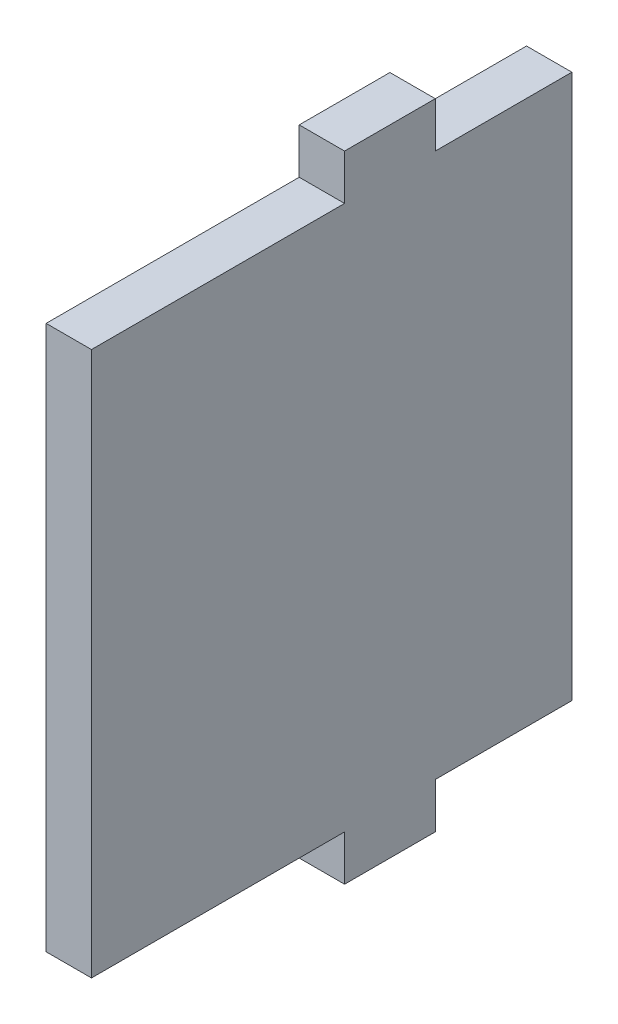
ISO-10303-21;
HEADER;
FILE_DESCRIPTION(('STEP AP214'),'2;1');
FILE_NAME('part.step','',(''),(''),'','','');
FILE_SCHEMA(('AUTOMOTIVE_DESIGN { 1 0 10303 214 1 1 1 1 }'));
ENDSEC;
DATA;
#1=APPLICATION_CONTEXT('core data for automotive mechanical design processes');
#2=APPLICATION_PROTOCOL_DEFINITION('international standard','automotive_design',2000,#1);
#3=PRODUCT_CONTEXT('',#1,'mechanical');
#4=PRODUCT('Part','Part','',(#3));
#5=PRODUCT_RELATED_PRODUCT_CATEGORY('part','',(#4));
#6=PRODUCT_DEFINITION_FORMATION('','',#4);
#7=PRODUCT_DEFINITION_CONTEXT('part definition',#1,'design');
#8=PRODUCT_DEFINITION('design','',#6,#7);
#9=PRODUCT_DEFINITION_SHAPE('','',#8);
#10=(LENGTH_UNIT() NAMED_UNIT(*) SI_UNIT(.MILLI.,.METRE.));
#11=(NAMED_UNIT(*) PLANE_ANGLE_UNIT() SI_UNIT($,.RADIAN.));
#12=(NAMED_UNIT(*) SI_UNIT($,.STERADIAN.) SOLID_ANGLE_UNIT());
#13=UNCERTAINTY_MEASURE_WITH_UNIT(LENGTH_MEASURE(1.E-05),#10,'distance_accuracy_value','');
#14=(GEOMETRIC_REPRESENTATION_CONTEXT(3) GLOBAL_UNCERTAINTY_ASSIGNED_CONTEXT((#13)) GLOBAL_UNIT_ASSIGNED_CONTEXT((#10,
#11,#12)) REPRESENTATION_CONTEXT('',''));
#15=CARTESIAN_POINT('',(0.,0.,0.));
#16=DIRECTION('',(0.,0.,1.));
#17=DIRECTION('',(1.,0.,0.));
#18=AXIS2_PLACEMENT_3D('',#15,#16,#17);
#19=CARTESIAN_POINT('',(2.5,-15.,0.));
#20=DIRECTION('',(0.,1.,0.));
#21=DIRECTION('',(0.,0.,1.));
#22=AXIS2_PLACEMENT_3D('',#19,#20,#21);
#23=PLANE('',#22);
#24=DIRECTION('',(0.,0.,-1.));
#25=VECTOR('',#24,1.);
#26=CARTESIAN_POINT('',(0.,-15.,0.));
#27=LINE('',#26,#25);
#28=CARTESIAN_POINT('',(0.,-15.,16.45));
#29=VERTEX_POINT('',#28);
#30=CARTESIAN_POINT('',(0.,-15.,2.5));
#31=VERTEX_POINT('',#30);
#32=EDGE_CURVE('E158',#29,#31,#27,.T.);
#33=ORIENTED_EDGE('',*,*,#32,.T.);
#34=DIRECTION('',(-1.,0.,0.));
#35=VECTOR('',#34,1.);
#36=CARTESIAN_POINT('',(2.5,-15.,2.5));
#37=LINE('',#36,#35);
#38=CARTESIAN_POINT('',(2.5,-15.,2.5));
#39=VERTEX_POINT('',#38);
#40=EDGE_CURVE('E11',#39,#31,#37,.T.);
#41=ORIENTED_EDGE('',*,*,#40,.F.);
#42=DIRECTION('',(0.,0.,-1.));
#43=VECTOR('',#42,1.);
#44=CARTESIAN_POINT('',(2.5,-15.,0.));
#45=LINE('',#44,#43);
#46=CARTESIAN_POINT('',(2.5,-15.,16.45));
#47=VERTEX_POINT('',#46);
#48=EDGE_CURVE('E186',#47,#39,#45,.T.);
#49=ORIENTED_EDGE('',*,*,#48,.F.);
#50=DIRECTION('',(-1.,0.,0.));
#51=VECTOR('',#50,1.);
#52=CARTESIAN_POINT('',(2.5,-15.,16.45));
#53=LINE('',#52,#51);
#54=EDGE_CURVE('E154',#47,#29,#53,.T.);
#55=ORIENTED_EDGE('',*,*,#54,.T.);
#56=EDGE_LOOP('',(#33,#41,#49,#55));
#57=FACE_BOUND('',#56,.T.);
#58=ADVANCED_FACE('F39',(#57),#23,.F.);
#59=CARTESIAN_POINT('',(2.5,0.,2.5));
#60=DIRECTION('',(0.,0.,-1.));
#61=DIRECTION('',(-1.,0.,0.));
#62=AXIS2_PLACEMENT_3D('',#59,#60,#61);
#63=PLANE('',#62);
#64=DIRECTION('',(0.,-1.,0.));
#65=VECTOR('',#64,1.);
#66=CARTESIAN_POINT('',(0.,0.,2.5));
#67=LINE('',#66,#65);
#68=CARTESIAN_POINT('',(0.,-17.5,2.5));
#69=VERTEX_POINT('',#68);
#70=EDGE_CURVE('E161',#31,#69,#67,.T.);
#71=ORIENTED_EDGE('',*,*,#70,.T.);
#72=DIRECTION('',(-1.,0.,0.));
#73=VECTOR('',#72,1.);
#74=CARTESIAN_POINT('',(2.5,-17.5,2.5));
#75=LINE('',#74,#73);
#76=CARTESIAN_POINT('',(2.5,-17.5,2.5));
#77=VERTEX_POINT('',#76);
#78=EDGE_CURVE('E47',#77,#69,#75,.T.);
#79=ORIENTED_EDGE('',*,*,#78,.F.);
#80=DIRECTION('',(0.,-1.,0.));
#81=VECTOR('',#80,1.);
#82=CARTESIAN_POINT('',(2.5,0.,2.5));
#83=LINE('',#82,#81);
#84=EDGE_CURVE('E106',#39,#77,#83,.T.);
#85=ORIENTED_EDGE('',*,*,#84,.F.);
#86=ORIENTED_EDGE('',*,*,#40,.T.);
#87=EDGE_LOOP('',(#71,#79,#85,#86));
#88=FACE_BOUND('',#87,.T.);
#89=ADVANCED_FACE('F256',(#88),#63,.F.);
#90=CARTESIAN_POINT('',(2.5,-17.5,0.));
#91=DIRECTION('',(0.,1.,0.));
#92=DIRECTION('',(0.,0.,1.));
#93=AXIS2_PLACEMENT_3D('',#90,#91,#92);
#94=PLANE('',#93);
#95=DIRECTION('',(0.,0.,-1.));
#96=VECTOR('',#95,1.);
#97=CARTESIAN_POINT('',(0.,-17.5,0.));
#98=LINE('',#97,#96);
#99=CARTESIAN_POINT('',(0.,-17.5,-2.5));
#100=VERTEX_POINT('',#99);
#101=EDGE_CURVE('E163',#69,#100,#98,.T.);
#102=ORIENTED_EDGE('',*,*,#101,.T.);
#103=DIRECTION('',(-1.,0.,0.));
#104=VECTOR('',#103,1.);
#105=CARTESIAN_POINT('',(2.5,-17.5,-2.5));
#106=LINE('',#105,#104);
#107=CARTESIAN_POINT('',(2.5,-17.5,-2.5));
#108=VERTEX_POINT('',#107);
#109=EDGE_CURVE('E201',#108,#100,#106,.T.);
#110=ORIENTED_EDGE('',*,*,#109,.F.);
#111=DIRECTION('',(0.,0.,-1.));
#112=VECTOR('',#111,1.);
#113=CARTESIAN_POINT('',(2.5,-17.5,0.));
#114=LINE('',#113,#112);
#115=EDGE_CURVE('E209',#77,#108,#114,.T.);
#116=ORIENTED_EDGE('',*,*,#115,.F.);
#117=ORIENTED_EDGE('',*,*,#78,.T.);
#118=EDGE_LOOP('',(#102,#110,#116,#117));
#119=FACE_BOUND('',#118,.T.);
#120=ADVANCED_FACE('F207',(#119),#94,.F.);
#121=CARTESIAN_POINT('',(2.5,0.,-2.5));
#122=DIRECTION('',(0.,0.,1.));
#123=DIRECTION('',(0.,-1.,0.));
#124=AXIS2_PLACEMENT_3D('',#121,#122,#123);
#125=PLANE('',#124);
#126=DIRECTION('',(0.,1.,0.));
#127=VECTOR('',#126,1.);
#128=CARTESIAN_POINT('',(0.,0.,-2.5));
#129=LINE('',#128,#127);
#130=CARTESIAN_POINT('',(0.,-15.,-2.5));
#131=VERTEX_POINT('',#130);
#132=EDGE_CURVE('E165',#100,#131,#129,.T.);
#133=ORIENTED_EDGE('',*,*,#132,.T.);
#134=DIRECTION('',(-1.,0.,0.));
#135=VECTOR('',#134,1.);
#136=CARTESIAN_POINT('',(2.5,-15.,-2.5));
#137=LINE('',#136,#135);
#138=CARTESIAN_POINT('',(2.5,-15.,-2.5));
#139=VERTEX_POINT('',#138);
#140=EDGE_CURVE('E198',#139,#131,#137,.T.);
#141=ORIENTED_EDGE('',*,*,#140,.F.);
#142=DIRECTION('',(0.,1.,0.));
#143=VECTOR('',#142,1.);
#144=CARTESIAN_POINT('',(2.5,0.,-2.5));
#145=LINE('',#144,#143);
#146=EDGE_CURVE('E227',#108,#139,#145,.T.);
#147=ORIENTED_EDGE('',*,*,#146,.F.);
#148=ORIENTED_EDGE('',*,*,#109,.T.);
#149=EDGE_LOOP('',(#133,#141,#147,#148));
#150=FACE_BOUND('',#149,.T.);
#151=ADVANCED_FACE('F217',(#150),#125,.F.);
#152=CARTESIAN_POINT('',(2.5,-15.,0.));
#153=DIRECTION('',(0.,1.,0.));
#154=DIRECTION('',(0.,0.,1.));
#155=AXIS2_PLACEMENT_3D('',#152,#153,#154);
#156=PLANE('',#155);
#157=DIRECTION('',(0.,0.,-1.));
#158=VECTOR('',#157,1.);
#159=CARTESIAN_POINT('',(0.,-15.,0.));
#160=LINE('',#159,#158);
#161=CARTESIAN_POINT('',(0.,-15.,-10.03));
#162=VERTEX_POINT('',#161);
#163=EDGE_CURVE('E167',#131,#162,#160,.T.);
#164=ORIENTED_EDGE('',*,*,#163,.T.);
#165=DIRECTION('',(-1.,0.,0.));
#166=VECTOR('',#165,1.);
#167=CARTESIAN_POINT('',(2.5,-15.,-10.03));
#168=LINE('',#167,#166);
#169=CARTESIAN_POINT('',(2.5,-15.,-10.03));
#170=VERTEX_POINT('',#169);
#171=EDGE_CURVE('E196',#170,#162,#168,.T.);
#172=ORIENTED_EDGE('',*,*,#171,.F.);
#173=DIRECTION('',(0.,0.,-1.));
#174=VECTOR('',#173,1.);
#175=CARTESIAN_POINT('',(2.5,-15.,0.));
#176=LINE('',#175,#174);
#177=EDGE_CURVE('E223',#139,#170,#176,.T.);
#178=ORIENTED_EDGE('',*,*,#177,.F.);
#179=ORIENTED_EDGE('',*,*,#140,.T.);
#180=EDGE_LOOP('',(#164,#172,#178,#179));
#181=FACE_BOUND('',#180,.T.);
#182=ADVANCED_FACE('F221',(#181),#156,.F.);
#183=CARTESIAN_POINT('',(2.5,0.,-10.03));
#184=DIRECTION('',(0.,0.,-1.));
#185=DIRECTION('',(-1.,0.,0.));
#186=AXIS2_PLACEMENT_3D('',#183,#184,#185);
#187=PLANE('',#186);
#188=DIRECTION('',(0.,-1.,0.));
#189=VECTOR('',#188,1.);
#190=CARTESIAN_POINT('',(0.,0.,-10.03));
#191=LINE('',#190,#189);
#192=CARTESIAN_POINT('',(0.,15.,-10.03));
#193=VERTEX_POINT('',#192);
#194=EDGE_CURVE('E170',#193,#162,#191,.T.);
#195=ORIENTED_EDGE('',*,*,#194,.F.);
#196=DIRECTION('',(-1.,0.,0.));
#197=VECTOR('',#196,1.);
#198=CARTESIAN_POINT('',(2.5,15.,-10.03));
#199=LINE('',#198,#197);
#200=CARTESIAN_POINT('',(2.5,15.,-10.03));
#201=VERTEX_POINT('',#200);
#202=EDGE_CURVE('E194',#201,#193,#199,.T.);
#203=ORIENTED_EDGE('',*,*,#202,.F.);
#204=DIRECTION('',(0.,-1.,0.));
#205=VECTOR('',#204,1.);
#206=CARTESIAN_POINT('',(2.5,0.,-10.03));
#207=LINE('',#206,#205);
#208=EDGE_CURVE('E226',#201,#170,#207,.T.);
#209=ORIENTED_EDGE('',*,*,#208,.T.);
#210=ORIENTED_EDGE('',*,*,#171,.T.);
#211=EDGE_LOOP('',(#195,#203,#209,#210));
#212=FACE_BOUND('',#211,.T.);
#213=ADVANCED_FACE('F269',(#212),#187,.T.);
#214=CARTESIAN_POINT('',(2.5,15.,0.));
#215=DIRECTION('',(0.,1.,0.));
#216=DIRECTION('',(0.,0.,1.));
#217=AXIS2_PLACEMENT_3D('',#214,#215,#216);
#218=PLANE('',#217);
#219=DIRECTION('',(0.,0.,-1.));
#220=VECTOR('',#219,1.);
#221=CARTESIAN_POINT('',(0.,15.,0.));
#222=LINE('',#221,#220);
#223=CARTESIAN_POINT('',(0.,15.,-2.5));
#224=VERTEX_POINT('',#223);
#225=EDGE_CURVE('E173',#224,#193,#222,.T.);
#226=ORIENTED_EDGE('',*,*,#225,.F.);
#227=DIRECTION('',(-1.,0.,0.));
#228=VECTOR('',#227,1.);
#229=CARTESIAN_POINT('',(2.5,15.,-2.5));
#230=LINE('',#229,#228);
#231=CARTESIAN_POINT('',(2.5,15.,-2.5));
#232=VERTEX_POINT('',#231);
#233=EDGE_CURVE('E192',#232,#224,#230,.T.);
#234=ORIENTED_EDGE('',*,*,#233,.F.);
#235=DIRECTION('',(0.,0.,-1.));
#236=VECTOR('',#235,1.);
#237=CARTESIAN_POINT('',(2.5,15.,0.));
#238=LINE('',#237,#236);
#239=EDGE_CURVE('E229',#232,#201,#238,.T.);
#240=ORIENTED_EDGE('',*,*,#239,.T.);
#241=ORIENTED_EDGE('',*,*,#202,.T.);
#242=EDGE_LOOP('',(#226,#234,#240,#241));
#243=FACE_BOUND('',#242,.T.);
#244=ADVANCED_FACE('F272',(#243),#218,.T.);
#245=CARTESIAN_POINT('',(2.5,0.,-2.5));
#246=DIRECTION('',(0.,0.,-1.));
#247=DIRECTION('',(0.,1.,0.));
#248=AXIS2_PLACEMENT_3D('',#245,#246,#247);
#249=PLANE('',#248);
#250=DIRECTION('',(0.,-1.,0.));
#251=VECTOR('',#250,1.);
#252=CARTESIAN_POINT('',(0.,0.,-2.5));
#253=LINE('',#252,#251);
#254=CARTESIAN_POINT('',(0.,17.5,-2.5));
#255=VERTEX_POINT('',#254);
#256=EDGE_CURVE('E176',#255,#224,#253,.T.);
#257=ORIENTED_EDGE('',*,*,#256,.F.);
#258=DIRECTION('',(-1.,0.,0.));
#259=VECTOR('',#258,1.);
#260=CARTESIAN_POINT('',(2.5,17.5,-2.5));
#261=LINE('',#260,#259);
#262=CARTESIAN_POINT('',(2.5,17.5,-2.5));
#263=VERTEX_POINT('',#262);
#264=EDGE_CURVE('E190',#263,#255,#261,.T.);
#265=ORIENTED_EDGE('',*,*,#264,.F.);
#266=DIRECTION('',(0.,-1.,0.));
#267=VECTOR('',#266,1.);
#268=CARTESIAN_POINT('',(2.5,0.,-2.5));
#269=LINE('',#268,#267);
#270=EDGE_CURVE('E236',#263,#232,#269,.T.);
#271=ORIENTED_EDGE('',*,*,#270,.T.);
#272=ORIENTED_EDGE('',*,*,#233,.T.);
#273=EDGE_LOOP('',(#257,#265,#271,#272));
#274=FACE_BOUND('',#273,.T.);
#275=ADVANCED_FACE('F276',(#274),#249,.T.);
#276=CARTESIAN_POINT('',(2.5,17.5,0.));
#277=DIRECTION('',(0.,1.,0.));
#278=DIRECTION('',(0.,0.,1.));
#279=AXIS2_PLACEMENT_3D('',#276,#277,#278);
#280=PLANE('',#279);
#281=DIRECTION('',(0.,0.,-1.));
#282=VECTOR('',#281,1.);
#283=CARTESIAN_POINT('',(0.,17.5,0.));
#284=LINE('',#283,#282);
#285=CARTESIAN_POINT('',(0.,17.5,2.5));
#286=VERTEX_POINT('',#285);
#287=EDGE_CURVE('E179',#286,#255,#284,.T.);
#288=ORIENTED_EDGE('',*,*,#287,.F.);
#289=DIRECTION('',(-1.,0.,0.));
#290=VECTOR('',#289,1.);
#291=CARTESIAN_POINT('',(2.5,17.5,2.5));
#292=LINE('',#291,#290);
#293=CARTESIAN_POINT('',(2.5,17.5,2.5));
#294=VERTEX_POINT('',#293);
#295=EDGE_CURVE('E143',#294,#286,#292,.T.);
#296=ORIENTED_EDGE('',*,*,#295,.F.);
#297=DIRECTION('',(0.,0.,-1.));
#298=VECTOR('',#297,1.);
#299=CARTESIAN_POINT('',(2.5,17.5,0.));
#300=LINE('',#299,#298);
#301=EDGE_CURVE('E150',#294,#263,#300,.T.);
#302=ORIENTED_EDGE('',*,*,#301,.T.);
#303=ORIENTED_EDGE('',*,*,#264,.T.);
#304=EDGE_LOOP('',(#288,#296,#302,#303));
#305=FACE_BOUND('',#304,.T.);
#306=ADVANCED_FACE('F240',(#305),#280,.T.);
#307=CARTESIAN_POINT('',(2.5,0.,2.5));
#308=DIRECTION('',(0.,0.,1.));
#309=DIRECTION('',(1.,0.,0.));
#310=AXIS2_PLACEMENT_3D('',#307,#308,#309);
#311=PLANE('',#310);
#312=DIRECTION('',(0.,1.,0.));
#313=VECTOR('',#312,1.);
#314=CARTESIAN_POINT('',(0.,0.,2.5));
#315=LINE('',#314,#313);
#316=CARTESIAN_POINT('',(0.,15.,2.5));
#317=VERTEX_POINT('',#316);
#318=EDGE_CURVE('E138',#317,#286,#315,.T.);
#319=ORIENTED_EDGE('',*,*,#318,.F.);
#320=DIRECTION('',(-1.,0.,0.));
#321=VECTOR('',#320,1.);
#322=CARTESIAN_POINT('',(2.5,15.,2.5));
#323=LINE('',#322,#321);
#324=CARTESIAN_POINT('',(2.5,15.,2.5));
#325=VERTEX_POINT('',#324);
#326=EDGE_CURVE('E133',#325,#317,#323,.T.);
#327=ORIENTED_EDGE('',*,*,#326,.F.);
#328=DIRECTION('',(0.,1.,0.));
#329=VECTOR('',#328,1.);
#330=CARTESIAN_POINT('',(2.5,0.,2.5));
#331=LINE('',#330,#329);
#332=EDGE_CURVE('E136',#325,#294,#331,.T.);
#333=ORIENTED_EDGE('',*,*,#332,.T.);
#334=ORIENTED_EDGE('',*,*,#295,.T.);
#335=EDGE_LOOP('',(#319,#327,#333,#334));
#336=FACE_BOUND('',#335,.T.);
#337=ADVANCED_FACE('F135',(#336),#311,.T.);
#338=CARTESIAN_POINT('',(2.5,15.,0.));
#339=DIRECTION('',(0.,1.,0.));
#340=DIRECTION('',(0.,0.,1.));
#341=AXIS2_PLACEMENT_3D('',#338,#339,#340);
#342=PLANE('',#341);
#343=DIRECTION('',(0.,0.,-1.));
#344=VECTOR('',#343,1.);
#345=CARTESIAN_POINT('',(0.,15.,0.));
#346=LINE('',#345,#344);
#347=CARTESIAN_POINT('',(0.,15.,16.45));
#348=VERTEX_POINT('',#347);
#349=EDGE_CURVE('E183',#348,#317,#346,.T.);
#350=ORIENTED_EDGE('',*,*,#349,.F.);
#351=DIRECTION('',(-1.,0.,0.));
#352=VECTOR('',#351,1.);
#353=CARTESIAN_POINT('',(2.5,15.,16.45));
#354=LINE('',#353,#352);
#355=CARTESIAN_POINT('',(2.5,15.,16.45));
#356=VERTEX_POINT('',#355);
#357=EDGE_CURVE('E95',#356,#348,#354,.T.);
#358=ORIENTED_EDGE('',*,*,#357,.F.);
#359=DIRECTION('',(0.,0.,-1.));
#360=VECTOR('',#359,1.);
#361=CARTESIAN_POINT('',(2.5,15.,0.));
#362=LINE('',#361,#360);
#363=EDGE_CURVE('E147',#356,#325,#362,.T.);
#364=ORIENTED_EDGE('',*,*,#363,.T.);
#365=ORIENTED_EDGE('',*,*,#326,.T.);
#366=EDGE_LOOP('',(#350,#358,#364,#365));
#367=FACE_BOUND('',#366,.T.);
#368=ADVANCED_FACE('F152',(#367),#342,.T.);
#369=CARTESIAN_POINT('',(2.5,0.,16.45));
#370=DIRECTION('',(0.,0.,-1.));
#371=DIRECTION('',(0.,1.,0.));
#372=AXIS2_PLACEMENT_3D('',#369,#370,#371);
#373=PLANE('',#372);
#374=DIRECTION('',(0.,-1.,0.));
#375=VECTOR('',#374,1.);
#376=CARTESIAN_POINT('',(0.,0.,16.45));
#377=LINE('',#376,#375);
#378=EDGE_CURVE('E98',#348,#29,#377,.T.);
#379=ORIENTED_EDGE('',*,*,#378,.T.);
#380=ORIENTED_EDGE('',*,*,#54,.F.);
#381=DIRECTION('',(0.,-1.,0.));
#382=VECTOR('',#381,1.);
#383=CARTESIAN_POINT('',(2.5,0.,16.45));
#384=LINE('',#383,#382);
#385=EDGE_CURVE('E55',#356,#47,#384,.T.);
#386=ORIENTED_EDGE('',*,*,#385,.F.);
#387=ORIENTED_EDGE('',*,*,#357,.T.);
#388=EDGE_LOOP('',(#379,#380,#386,#387));
#389=FACE_BOUND('',#388,.T.);
#390=ADVANCED_FACE('F245',(#389),#373,.F.);
#391=CARTESIAN_POINT('',(2.5,0.,0.));
#392=DIRECTION('',(1.,0.,0.));
#393=DIRECTION('',(0.,0.,-1.));
#394=AXIS2_PLACEMENT_3D('',#391,#392,#393);
#395=PLANE('',#394);
#396=ORIENTED_EDGE('',*,*,#48,.T.);
#397=ORIENTED_EDGE('',*,*,#84,.T.);
#398=ORIENTED_EDGE('',*,*,#115,.T.);
#399=ORIENTED_EDGE('',*,*,#146,.T.);
#400=ORIENTED_EDGE('',*,*,#177,.T.);
#401=ORIENTED_EDGE('',*,*,#208,.F.);
#402=ORIENTED_EDGE('',*,*,#239,.F.);
#403=ORIENTED_EDGE('',*,*,#270,.F.);
#404=ORIENTED_EDGE('',*,*,#301,.F.);
#405=ORIENTED_EDGE('',*,*,#332,.F.);
#406=ORIENTED_EDGE('',*,*,#363,.F.);
#407=ORIENTED_EDGE('',*,*,#385,.T.);
#408=EDGE_LOOP('',(#396,#397,#398,#399,#400,#401,#402,#403,#404,#405,#406,#407));
#409=FACE_BOUND('',#408,.T.);
#410=ADVANCED_FACE('F146',(#409),#395,.T.);
#411=CARTESIAN_POINT('',(0.,0.,0.));
#412=DIRECTION('',(1.,0.,0.));
#413=DIRECTION('',(0.,0.,-1.));
#414=AXIS2_PLACEMENT_3D('',#411,#412,#413);
#415=PLANE('',#414);
#416=ORIENTED_EDGE('',*,*,#32,.F.);
#417=ORIENTED_EDGE('',*,*,#378,.F.);
#418=ORIENTED_EDGE('',*,*,#349,.T.);
#419=ORIENTED_EDGE('',*,*,#318,.T.);
#420=ORIENTED_EDGE('',*,*,#287,.T.);
#421=ORIENTED_EDGE('',*,*,#256,.T.);
#422=ORIENTED_EDGE('',*,*,#225,.T.);
#423=ORIENTED_EDGE('',*,*,#194,.T.);
#424=ORIENTED_EDGE('',*,*,#163,.F.);
#425=ORIENTED_EDGE('',*,*,#132,.F.);
#426=ORIENTED_EDGE('',*,*,#101,.F.);
#427=ORIENTED_EDGE('',*,*,#70,.F.);
#428=EDGE_LOOP('',(#416,#417,#418,#419,#420,#421,#422,#423,#424,#425,#426,#427));
#429=FACE_BOUND('',#428,.T.);
#430=ADVANCED_FACE('F213',(#429),#415,.F.);
#431=CLOSED_SHELL('',(#58,#89,#120,#151,#182,#213,#244,#275,#306,#337,#368,#390,#410,#430));
#432=MANIFOLD_SOLID_BREP('B2',#431);
#433=ADVANCED_BREP_SHAPE_REPRESENTATION('',(#18,#432),#14);
#434=SHAPE_DEFINITION_REPRESENTATION(#9,#433);
ENDSEC;
END-ISO-10303-21;
